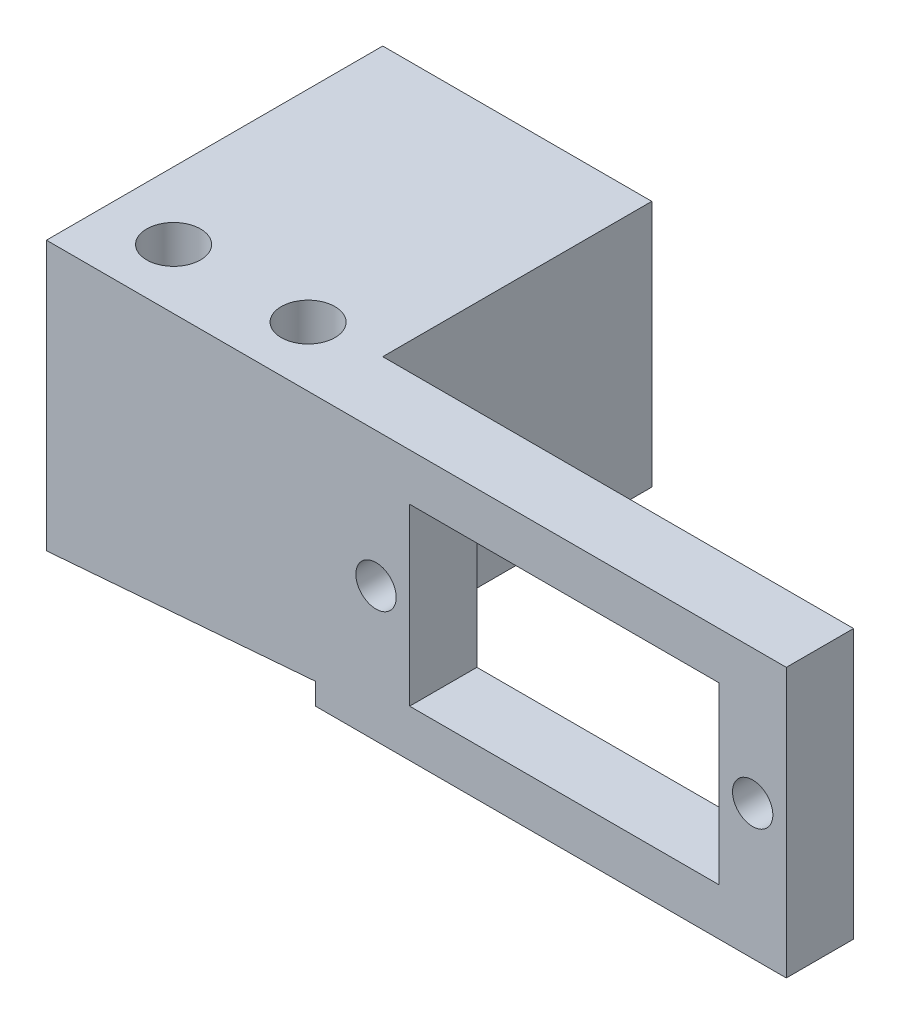
ISO-10303-21;
HEADER;
FILE_DESCRIPTION(('STEP AP214'),'2;1');
FILE_NAME('part.step','',(''),(''),'','','');
FILE_SCHEMA(('AUTOMOTIVE_DESIGN { 1 0 10303 214 1 1 1 1 }'));
ENDSEC;
DATA;
#1=APPLICATION_CONTEXT('core data for automotive mechanical design processes');
#2=APPLICATION_PROTOCOL_DEFINITION('international standard','automotive_design',2000,#1);
#3=PRODUCT_CONTEXT('',#1,'mechanical');
#4=PRODUCT('Part','Part','',(#3));
#5=PRODUCT_RELATED_PRODUCT_CATEGORY('part','',(#4));
#6=PRODUCT_DEFINITION_FORMATION('','',#4);
#7=PRODUCT_DEFINITION_CONTEXT('part definition',#1,'design');
#8=PRODUCT_DEFINITION('design','',#6,#7);
#9=PRODUCT_DEFINITION_SHAPE('','',#8);
#10=(LENGTH_UNIT() NAMED_UNIT(*) SI_UNIT(.MILLI.,.METRE.));
#11=(NAMED_UNIT(*) PLANE_ANGLE_UNIT() SI_UNIT($,.RADIAN.));
#12=(NAMED_UNIT(*) SI_UNIT($,.STERADIAN.) SOLID_ANGLE_UNIT());
#13=UNCERTAINTY_MEASURE_WITH_UNIT(LENGTH_MEASURE(1.E-05),#10,'distance_accuracy_value','');
#14=(GEOMETRIC_REPRESENTATION_CONTEXT(3) GLOBAL_UNCERTAINTY_ASSIGNED_CONTEXT((#13)) GLOBAL_UNIT_ASSIGNED_CONTEXT((#10,
#11,#12)) REPRESENTATION_CONTEXT('',''));
#15=CARTESIAN_POINT('',(0.,0.,0.));
#16=DIRECTION('',(0.,0.,1.));
#17=DIRECTION('',(1.,0.,0.));
#18=AXIS2_PLACEMENT_3D('',#15,#16,#17);
#19=CARTESIAN_POINT('',(-28.3333333333334,8.33333333333334,10.));
#20=DIRECTION('',(1.,0.,0.));
#21=DIRECTION('',(0.,0.,-1.));
#22=AXIS2_PLACEMENT_3D('',#19,#20,#21);
#23=PLANE('',#22);
#24=DIRECTION('',(0.,0.,-1.));
#25=VECTOR('',#24,1.);
#26=CARTESIAN_POINT('',(-28.3333333333334,8.33333333333334,10.));
#27=LINE('',#26,#25);
#28=CARTESIAN_POINT('',(-28.3333333333334,8.33333333333334,10.));
#29=VERTEX_POINT('',#28);
#30=CARTESIAN_POINT('',(-28.3333333333334,8.33333333333334,-15.));
#31=VERTEX_POINT('',#30);
#32=EDGE_CURVE('E154',#29,#31,#27,.T.);
#33=ORIENTED_EDGE('',*,*,#32,.T.);
#34=DIRECTION('',(0.,1.,0.));
#35=VECTOR('',#34,1.);
#36=CARTESIAN_POINT('',(-28.3333333333334,-11.6666666666667,-15.));
#37=LINE('',#36,#35);
#38=CARTESIAN_POINT('',(-28.3333333333334,-11.6666666666667,-15.));
#39=VERTEX_POINT('',#38);
#40=EDGE_CURVE('E182',#39,#31,#37,.T.);
#41=ORIENTED_EDGE('',*,*,#40,.F.);
#42=DIRECTION('',(0.,0.,-1.));
#43=VECTOR('',#42,1.);
#44=CARTESIAN_POINT('',(-28.3333333333334,-11.6666666666667,10.));
#45=LINE('',#44,#43);
#46=CARTESIAN_POINT('',(-28.3333333333334,-11.6666666666667,10.));
#47=VERTEX_POINT('',#46);
#48=EDGE_CURVE('E47',#47,#39,#45,.T.);
#49=ORIENTED_EDGE('',*,*,#48,.F.);
#50=DIRECTION('',(0.,-1.,0.));
#51=VECTOR('',#50,1.);
#52=CARTESIAN_POINT('',(-28.3333333333334,8.33333333333334,10.));
#53=LINE('',#52,#51);
#54=EDGE_CURVE('E239',#29,#47,#53,.T.);
#55=ORIENTED_EDGE('',*,*,#54,.F.);
#56=EDGE_LOOP('',(#33,#41,#49,#55));
#57=FACE_BOUND('',#56,.T.);
#58=ADVANCED_FACE('F39',(#57),#23,.F.);
#59=CARTESIAN_POINT('',(-28.3333333333334,-11.6666666666667,10.));
#60=DIRECTION('',(0.,1.,0.));
#61=DIRECTION('',(0.,0.,1.));
#62=AXIS2_PLACEMENT_3D('',#59,#60,#61);
#63=PLANE('',#62);
#64=DIRECTION('',(0.,0.,-1.));
#65=VECTOR('',#64,1.);
#66=CARTESIAN_POINT('',(-8.33333333333336,-11.6666666666667,15.));
#67=LINE('',#66,#65);
#68=CARTESIAN_POINT('',(-8.33333333333336,-11.6666666666667,10.));
#69=VERTEX_POINT('',#68);
#70=CARTESIAN_POINT('',(-8.33333333333336,-11.6666666666667,5.));
#71=VERTEX_POINT('',#70);
#72=EDGE_CURVE('E142',#69,#71,#67,.T.);
#73=ORIENTED_EDGE('',*,*,#72,.T.);
#74=DIRECTION('',(-1.,0.,0.));
#75=VECTOR('',#74,1.);
#76=CARTESIAN_POINT('',(26.6666666666666,-11.6666666666667,5.));
#77=LINE('',#76,#75);
#78=CARTESIAN_POINT('',(26.6666666666666,-11.6666666666667,5.));
#79=VERTEX_POINT('',#78);
#80=EDGE_CURVE('E62',#79,#71,#77,.T.);
#81=ORIENTED_EDGE('',*,*,#80,.F.);
#82=DIRECTION('',(0.,0.,-1.));
#83=VECTOR('',#82,1.);
#84=CARTESIAN_POINT('',(26.6666666666666,-11.6666666666667,10.));
#85=LINE('',#84,#83);
#86=CARTESIAN_POINT('',(26.6666666666666,-11.6666666666667,10.));
#87=VERTEX_POINT('',#86);
#88=EDGE_CURVE('E140',#87,#79,#85,.T.);
#89=ORIENTED_EDGE('',*,*,#88,.F.);
#90=DIRECTION('',(1.,0.,0.));
#91=VECTOR('',#90,1.);
#92=CARTESIAN_POINT('',(-28.3333333333334,-11.6666666666667,10.));
#93=LINE('',#92,#91);
#94=EDGE_CURVE('E246',#69,#87,#93,.T.);
#95=ORIENTED_EDGE('',*,*,#94,.F.);
#96=EDGE_LOOP('',(#73,#81,#89,#95));
#97=FACE_BOUND('',#96,.T.);
#98=ADVANCED_FACE('F138',(#97),#63,.F.);
#99=CARTESIAN_POINT('',(26.6666666666666,8.33333333333334,10.));
#100=DIRECTION('',(-1.,0.,0.));
#101=DIRECTION('',(0.,0.,1.));
#102=AXIS2_PLACEMENT_3D('',#99,#100,#101);
#103=PLANE('',#102);
#104=ORIENTED_EDGE('',*,*,#88,.T.);
#105=DIRECTION('',(0.,-1.,0.));
#106=VECTOR('',#105,1.);
#107=CARTESIAN_POINT('',(26.6666666666666,-11.6666666666667,5.));
#108=LINE('',#107,#106);
#109=CARTESIAN_POINT('',(26.6666666666666,8.33333333333334,5.));
#110=VERTEX_POINT('',#109);
#111=EDGE_CURVE('E123',#110,#79,#108,.T.);
#112=ORIENTED_EDGE('',*,*,#111,.F.);
#113=DIRECTION('',(0.,0.,-1.));
#114=VECTOR('',#113,1.);
#115=CARTESIAN_POINT('',(26.6666666666666,8.33333333333334,10.));
#116=LINE('',#115,#114);
#117=CARTESIAN_POINT('',(26.6666666666666,8.33333333333334,10.));
#118=VERTEX_POINT('',#117);
#119=EDGE_CURVE('E149',#118,#110,#116,.T.);
#120=ORIENTED_EDGE('',*,*,#119,.F.);
#121=DIRECTION('',(0.,1.,0.));
#122=VECTOR('',#121,1.);
#123=CARTESIAN_POINT('',(26.6666666666666,8.33333333333334,10.));
#124=LINE('',#123,#122);
#125=EDGE_CURVE('E147',#87,#118,#124,.T.);
#126=ORIENTED_EDGE('',*,*,#125,.F.);
#127=EDGE_LOOP('',(#104,#112,#120,#126));
#128=FACE_BOUND('',#127,.T.);
#129=ADVANCED_FACE('F146',(#128),#103,.F.);
#130=CARTESIAN_POINT('',(-28.3333333333334,8.33333333333334,10.));
#131=DIRECTION('',(0.,-1.,0.));
#132=DIRECTION('',(0.,0.,-1.));
#133=AXIS2_PLACEMENT_3D('',#130,#131,#132);
#134=PLANE('',#133);
#135=CARTESIAN_POINT('',(-23.3333333333334,8.33333333333334,5.54812466747023));
#136=DIRECTION('',(0.,1.,0.));
#137=DIRECTION('',(0.,0.,1.));
#138=AXIS2_PLACEMENT_3D('',#135,#136,#137);
#139=CIRCLE('',#138,2.);
#140=CARTESIAN_POINT('',(-23.3333333333334,8.33333333333334,7.54812466747024));
#141=VERTEX_POINT('',#140);
#142=EDGE_CURVE('E235',#141,#141,#139,.T.);
#143=ORIENTED_EDGE('',*,*,#142,.F.);
#144=EDGE_LOOP('',(#143));
#145=FACE_BOUND('',#144,.T.);
#146=CARTESIAN_POINT('',(-13.3333333333334,8.33333333333334,5.54812466747023));
#147=DIRECTION('',(0.,1.,0.));
#148=DIRECTION('',(0.,0.,1.));
#149=AXIS2_PLACEMENT_3D('',#146,#147,#148);
#150=CIRCLE('',#149,2.);
#151=CARTESIAN_POINT('',(-13.3333333333334,8.33333333333334,7.54812466747023));
#152=VERTEX_POINT('',#151);
#153=EDGE_CURVE('E226',#152,#152,#150,.T.);
#154=ORIENTED_EDGE('',*,*,#153,.F.);
#155=EDGE_LOOP('',(#154));
#156=FACE_BOUND('',#155,.T.);
#157=DIRECTION('',(1.,0.,0.));
#158=VECTOR('',#157,1.);
#159=CARTESIAN_POINT('',(26.6666666666666,8.33333333333334,5.));
#160=LINE('',#159,#158);
#161=CARTESIAN_POINT('',(-8.33333333333336,8.33333333333334,5.));
#162=VERTEX_POINT('',#161);
#163=EDGE_CURVE('E128',#162,#110,#160,.T.);
#164=ORIENTED_EDGE('',*,*,#163,.F.);
#165=DIRECTION('',(0.,0.,1.));
#166=VECTOR('',#165,1.);
#167=CARTESIAN_POINT('',(-8.33333333333336,8.33333333333334,-15.));
#168=LINE('',#167,#166);
#169=CARTESIAN_POINT('',(-8.33333333333336,8.33333333333334,-15.));
#170=VERTEX_POINT('',#169);
#171=EDGE_CURVE('E195',#170,#162,#168,.T.);
#172=ORIENTED_EDGE('',*,*,#171,.F.);
#173=DIRECTION('',(1.,0.,0.));
#174=VECTOR('',#173,1.);
#175=CARTESIAN_POINT('',(-28.3333333333334,8.33333333333334,-15.));
#176=LINE('',#175,#174);
#177=EDGE_CURVE('E186',#31,#170,#176,.T.);
#178=ORIENTED_EDGE('',*,*,#177,.F.);
#179=ORIENTED_EDGE('',*,*,#32,.F.);
#180=DIRECTION('',(-1.,0.,0.));
#181=VECTOR('',#180,1.);
#182=CARTESIAN_POINT('',(-28.3333333333334,8.33333333333334,10.));
#183=LINE('',#182,#181);
#184=EDGE_CURVE('E251',#118,#29,#183,.T.);
#185=ORIENTED_EDGE('',*,*,#184,.F.);
#186=ORIENTED_EDGE('',*,*,#119,.T.);
#187=EDGE_LOOP('',(#164,#172,#178,#179,#185,#186));
#188=FACE_BOUND('',#187,.T.);
#189=ADVANCED_FACE('F266',(#145,#156,#188),#134,.F.);
#190=CARTESIAN_POINT('',(0.,0.,10.));
#191=DIRECTION('',(0.,0.,1.));
#192=DIRECTION('',(1.,0.,0.));
#193=AXIS2_PLACEMENT_3D('',#190,#191,#192);
#194=PLANE('',#193);
#195=DIRECTION('',(-0.996815278536125,-0.07974522228289,0.));
#196=VECTOR('',#195,1.);
#197=CARTESIAN_POINT('',(0.747217806041335,-9.34022257551669,10.));
#198=LINE('',#197,#196);
#199=CARTESIAN_POINT('',(-8.33333333333336,-10.0666666666667,10.));
#200=VERTEX_POINT('',#199);
#201=EDGE_CURVE('E166',#200,#47,#198,.T.);
#202=ORIENTED_EDGE('',*,*,#201,.F.);
#203=DIRECTION('',(0.,1.,0.));
#204=VECTOR('',#203,1.);
#205=CARTESIAN_POINT('',(-8.33333333333336,0.,10.));
#206=LINE('',#205,#204);
#207=EDGE_CURVE('E11',#69,#200,#206,.T.);
#208=ORIENTED_EDGE('',*,*,#207,.F.);
#209=ORIENTED_EDGE('',*,*,#94,.T.);
#210=ORIENTED_EDGE('',*,*,#125,.T.);
#211=ORIENTED_EDGE('',*,*,#184,.T.);
#212=ORIENTED_EDGE('',*,*,#54,.T.);
#213=EDGE_LOOP('',(#202,#208,#209,#210,#211,#212));
#214=FACE_BOUND('',#213,.T.);
#215=CARTESIAN_POINT('',(-3.83333333333336,-1.66666666666666,10.));
#216=DIRECTION('',(0.,0.,1.));
#217=DIRECTION('',(1.,0.,0.));
#218=AXIS2_PLACEMENT_3D('',#215,#216,#217);
#219=CIRCLE('',#218,1.5);
#220=CARTESIAN_POINT('',(-2.33333333333336,-1.66666666666666,10.));
#221=VERTEX_POINT('',#220);
#222=EDGE_CURVE('E198',#221,#221,#219,.T.);
#223=ORIENTED_EDGE('',*,*,#222,.F.);
#224=EDGE_LOOP('',(#223));
#225=FACE_BOUND('',#224,.T.);
#226=CARTESIAN_POINT('',(24.1666666666666,-1.66666666666666,10.));
#227=DIRECTION('',(0.,0.,1.));
#228=DIRECTION('',(1.,0.,0.));
#229=AXIS2_PLACEMENT_3D('',#226,#227,#228);
#230=CIRCLE('',#229,1.5);
#231=CARTESIAN_POINT('',(25.6666666666666,-1.66666666666666,10.));
#232=VERTEX_POINT('',#231);
#233=EDGE_CURVE('E199',#232,#232,#230,.T.);
#234=ORIENTED_EDGE('',*,*,#233,.F.);
#235=EDGE_LOOP('',(#234));
#236=FACE_BOUND('',#235,.T.);
#237=DIRECTION('',(0.,1.,0.));
#238=VECTOR('',#237,1.);
#239=CARTESIAN_POINT('',(21.6666666666666,4.83333333333334,10.));
#240=LINE('',#239,#238);
#241=CARTESIAN_POINT('',(21.6666666666666,-8.16666666666666,10.));
#242=VERTEX_POINT('',#241);
#243=CARTESIAN_POINT('',(21.6666666666666,4.83333333333334,10.));
#244=VERTEX_POINT('',#243);
#245=EDGE_CURVE('E203',#242,#244,#240,.T.);
#246=ORIENTED_EDGE('',*,*,#245,.F.);
#247=DIRECTION('',(1.,0.,0.));
#248=VECTOR('',#247,1.);
#249=CARTESIAN_POINT('',(21.6666666666666,-8.16666666666666,10.));
#250=LINE('',#249,#248);
#251=CARTESIAN_POINT('',(-1.33333333333336,-8.16666666666666,10.));
#252=VERTEX_POINT('',#251);
#253=EDGE_CURVE('E218',#252,#242,#250,.T.);
#254=ORIENTED_EDGE('',*,*,#253,.F.);
#255=DIRECTION('',(0.,-1.,0.));
#256=VECTOR('',#255,1.);
#257=CARTESIAN_POINT('',(-1.33333333333336,4.83333333333334,10.));
#258=LINE('',#257,#256);
#259=CARTESIAN_POINT('',(-1.33333333333336,4.83333333333334,10.));
#260=VERTEX_POINT('',#259);
#261=EDGE_CURVE('E214',#260,#252,#258,.T.);
#262=ORIENTED_EDGE('',*,*,#261,.F.);
#263=DIRECTION('',(-1.,0.,0.));
#264=VECTOR('',#263,1.);
#265=CARTESIAN_POINT('',(21.6666666666666,4.83333333333334,10.));
#266=LINE('',#265,#264);
#267=EDGE_CURVE('E210',#244,#260,#266,.T.);
#268=ORIENTED_EDGE('',*,*,#267,.F.);
#269=EDGE_LOOP('',(#246,#254,#262,#268));
#270=FACE_BOUND('',#269,.T.);
#271=ADVANCED_FACE('F279',(#214,#225,#236,#270),#194,.T.);
#272=CARTESIAN_POINT('',(-13.3333333333334,-11.6666666666667,5.54812466747023));
#273=DIRECTION('',(0.,1.,0.));
#274=DIRECTION('',(0.,0.,1.));
#275=AXIS2_PLACEMENT_3D('',#272,#273,#274);
#276=CYLINDRICAL_SURFACE('',#275,2.);
#277=CARTESIAN_POINT('',(-13.3333333333334,-10.4666666666667,5.54812466747023));
#278=DIRECTION('',(-0.07974522228289,0.996815278536125,0.));
#279=DIRECTION('',(0.996815278536125,0.07974522228289,0.));
#280=AXIS2_PLACEMENT_3D('',#277,#278,#279);
#281=ELLIPSE('',#280,2.00638979263751,2.);
#282=CARTESIAN_POINT('',(-11.3333333333334,-10.3066666666667,5.54812466747023));
#283=VERTEX_POINT('',#282);
#284=EDGE_CURVE('E160',#283,#283,#281,.F.);
#285=ORIENTED_EDGE('',*,*,#284,.T.);
#286=EDGE_LOOP('',(#285));
#287=FACE_BOUND('',#286,.T.);
#288=ORIENTED_EDGE('',*,*,#153,.T.);
#289=EDGE_LOOP('',(#288));
#290=FACE_BOUND('',#289,.T.);
#291=ADVANCED_FACE('F348',(#287,#290),#276,.F.);
#292=CARTESIAN_POINT('',(-23.3333333333334,-11.6666666666667,5.54812466747023));
#293=DIRECTION('',(0.,1.,0.));
#294=DIRECTION('',(0.,0.,1.));
#295=AXIS2_PLACEMENT_3D('',#292,#293,#294);
#296=CYLINDRICAL_SURFACE('',#295,2.);
#297=CARTESIAN_POINT('',(-23.3333333333334,-11.2666666666667,5.54812466747023));
#298=DIRECTION('',(-0.07974522228289,0.996815278536125,0.));
#299=DIRECTION('',(0.996815278536125,0.07974522228289,0.));
#300=AXIS2_PLACEMENT_3D('',#297,#298,#299);
#301=ELLIPSE('',#300,2.00638979263752,2.);
#302=CARTESIAN_POINT('',(-21.3333333333334,-11.1066666666667,5.54812466747023));
#303=VERTEX_POINT('',#302);
#304=EDGE_CURVE('E157',#303,#303,#301,.F.);
#305=ORIENTED_EDGE('',*,*,#304,.T.);
#306=EDGE_LOOP('',(#305));
#307=FACE_BOUND('',#306,.T.);
#308=ORIENTED_EDGE('',*,*,#142,.T.);
#309=EDGE_LOOP('',(#308));
#310=FACE_BOUND('',#309,.T.);
#311=ADVANCED_FACE('F351',(#307,#310),#296,.F.);
#312=CARTESIAN_POINT('',(21.6666666666666,4.83333333333334,-10.));
#313=DIRECTION('',(1.,0.,0.));
#314=DIRECTION('',(0.,0.,-1.));
#315=AXIS2_PLACEMENT_3D('',#312,#313,#314);
#316=PLANE('',#315);
#317=DIRECTION('',(0.,0.,1.));
#318=VECTOR('',#317,1.);
#319=CARTESIAN_POINT('',(21.6666666666666,4.83333333333334,-10.));
#320=LINE('',#319,#318);
#321=CARTESIAN_POINT('',(21.6666666666666,4.83333333333334,5.));
#322=VERTEX_POINT('',#321);
#323=EDGE_CURVE('E222',#322,#244,#320,.T.);
#324=ORIENTED_EDGE('',*,*,#323,.F.);
#325=DIRECTION('',(0.,-1.,0.));
#326=VECTOR('',#325,1.);
#327=CARTESIAN_POINT('',(21.6666666666666,4.83333333333334,5.));
#328=LINE('',#327,#326);
#329=CARTESIAN_POINT('',(21.6666666666666,-8.16666666666666,5.));
#330=VERTEX_POINT('',#329);
#331=EDGE_CURVE('E54',#322,#330,#328,.T.);
#332=ORIENTED_EDGE('',*,*,#331,.T.);
#333=DIRECTION('',(0.,0.,1.));
#334=VECTOR('',#333,1.);
#335=CARTESIAN_POINT('',(21.6666666666666,-8.16666666666666,-10.));
#336=LINE('',#335,#334);
#337=EDGE_CURVE('E223',#330,#242,#336,.T.);
#338=ORIENTED_EDGE('',*,*,#337,.T.);
#339=ORIENTED_EDGE('',*,*,#245,.T.);
#340=EDGE_LOOP('',(#324,#332,#338,#339));
#341=FACE_BOUND('',#340,.T.);
#342=ADVANCED_FACE('F313',(#341),#316,.F.);
#343=CARTESIAN_POINT('',(21.6666666666666,-8.16666666666666,-10.));
#344=DIRECTION('',(0.,-1.,0.));
#345=DIRECTION('',(1.,0.,0.));
#346=AXIS2_PLACEMENT_3D('',#343,#344,#345);
#347=PLANE('',#346);
#348=ORIENTED_EDGE('',*,*,#337,.F.);
#349=DIRECTION('',(-1.,0.,0.));
#350=VECTOR('',#349,1.);
#351=CARTESIAN_POINT('',(21.6666666666666,-8.16666666666666,5.));
#352=LINE('',#351,#350);
#353=CARTESIAN_POINT('',(-1.33333333333336,-8.16666666666666,5.));
#354=VERTEX_POINT('',#353);
#355=EDGE_CURVE('E304',#330,#354,#352,.T.);
#356=ORIENTED_EDGE('',*,*,#355,.T.);
#357=DIRECTION('',(0.,0.,1.));
#358=VECTOR('',#357,1.);
#359=CARTESIAN_POINT('',(-1.33333333333336,-8.16666666666666,-10.));
#360=LINE('',#359,#358);
#361=EDGE_CURVE('E227',#354,#252,#360,.T.);
#362=ORIENTED_EDGE('',*,*,#361,.T.);
#363=ORIENTED_EDGE('',*,*,#253,.T.);
#364=EDGE_LOOP('',(#348,#356,#362,#363));
#365=FACE_BOUND('',#364,.T.);
#366=ADVANCED_FACE('F314',(#365),#347,.F.);
#367=CARTESIAN_POINT('',(-1.33333333333336,4.83333333333334,-10.));
#368=DIRECTION('',(-1.,0.,0.));
#369=DIRECTION('',(0.,-1.,0.));
#370=AXIS2_PLACEMENT_3D('',#367,#368,#369);
#371=PLANE('',#370);
#372=ORIENTED_EDGE('',*,*,#361,.F.);
#373=DIRECTION('',(0.,1.,0.));
#374=VECTOR('',#373,1.);
#375=CARTESIAN_POINT('',(-1.33333333333336,4.83333333333334,5.));
#376=LINE('',#375,#374);
#377=CARTESIAN_POINT('',(-1.33333333333336,4.83333333333334,5.));
#378=VERTEX_POINT('',#377);
#379=EDGE_CURVE('E301',#354,#378,#376,.T.);
#380=ORIENTED_EDGE('',*,*,#379,.T.);
#381=DIRECTION('',(0.,0.,1.));
#382=VECTOR('',#381,1.);
#383=CARTESIAN_POINT('',(-1.33333333333336,4.83333333333334,-10.));
#384=LINE('',#383,#382);
#385=EDGE_CURVE('E230',#378,#260,#384,.T.);
#386=ORIENTED_EDGE('',*,*,#385,.T.);
#387=ORIENTED_EDGE('',*,*,#261,.T.);
#388=EDGE_LOOP('',(#372,#380,#386,#387));
#389=FACE_BOUND('',#388,.T.);
#390=ADVANCED_FACE('F324',(#389),#371,.F.);
#391=CARTESIAN_POINT('',(21.6666666666666,4.83333333333334,-10.));
#392=DIRECTION('',(0.,1.,0.));
#393=DIRECTION('',(-1.,0.,0.));
#394=AXIS2_PLACEMENT_3D('',#391,#392,#393);
#395=PLANE('',#394);
#396=ORIENTED_EDGE('',*,*,#385,.F.);
#397=DIRECTION('',(1.,0.,0.));
#398=VECTOR('',#397,1.);
#399=CARTESIAN_POINT('',(21.6666666666666,4.83333333333334,5.));
#400=LINE('',#399,#398);
#401=EDGE_CURVE('E298',#378,#322,#400,.T.);
#402=ORIENTED_EDGE('',*,*,#401,.T.);
#403=ORIENTED_EDGE('',*,*,#323,.T.);
#404=ORIENTED_EDGE('',*,*,#267,.T.);
#405=EDGE_LOOP('',(#396,#402,#403,#404));
#406=FACE_BOUND('',#405,.T.);
#407=ADVANCED_FACE('F322',(#406),#395,.F.);
#408=CARTESIAN_POINT('',(24.1666666666666,-1.66666666666666,-10.));
#409=DIRECTION('',(0.,0.,1.));
#410=DIRECTION('',(1.,0.,0.));
#411=AXIS2_PLACEMENT_3D('',#408,#409,#410);
#412=CYLINDRICAL_SURFACE('',#411,1.5);
#413=CARTESIAN_POINT('',(24.1666666666666,-1.66666666666666,5.));
#414=DIRECTION('',(0.,0.,1.));
#415=DIRECTION('',(1.,0.,0.));
#416=AXIS2_PLACEMENT_3D('',#413,#414,#415);
#417=CIRCLE('',#416,1.5);
#418=CARTESIAN_POINT('',(25.6666666666666,-1.66666666666666,5.));
#419=VERTEX_POINT('',#418);
#420=EDGE_CURVE('E294',#419,#419,#417,.F.);
#421=ORIENTED_EDGE('',*,*,#420,.T.);
#422=EDGE_LOOP('',(#421));
#423=FACE_BOUND('',#422,.T.);
#424=ORIENTED_EDGE('',*,*,#233,.T.);
#425=EDGE_LOOP('',(#424));
#426=FACE_BOUND('',#425,.T.);
#427=ADVANCED_FACE('F331',(#423,#426),#412,.F.);
#428=CARTESIAN_POINT('',(-3.83333333333336,-1.66666666666666,-10.));
#429=DIRECTION('',(0.,0.,1.));
#430=DIRECTION('',(1.,0.,0.));
#431=AXIS2_PLACEMENT_3D('',#428,#429,#430);
#432=CYLINDRICAL_SURFACE('',#431,1.5);
#433=CARTESIAN_POINT('',(-3.83333333333336,-1.66666666666666,5.));
#434=DIRECTION('',(0.,0.,1.));
#435=DIRECTION('',(1.,0.,0.));
#436=AXIS2_PLACEMENT_3D('',#433,#434,#435);
#437=CIRCLE('',#436,1.5);
#438=CARTESIAN_POINT('',(-2.33333333333336,-1.66666666666666,5.));
#439=VERTEX_POINT('',#438);
#440=EDGE_CURVE('E288',#439,#439,#437,.F.);
#441=ORIENTED_EDGE('',*,*,#440,.T.);
#442=EDGE_LOOP('',(#441));
#443=FACE_BOUND('',#442,.T.);
#444=ORIENTED_EDGE('',*,*,#222,.T.);
#445=EDGE_LOOP('',(#444));
#446=FACE_BOUND('',#445,.T.);
#447=ADVANCED_FACE('F384',(#443,#446),#432,.F.);
#448=CARTESIAN_POINT('',(-8.33333333333336,-10.0666666666667,-15.));
#449=DIRECTION('',(-0.07974522228289,0.996815278536125,0.));
#450=DIRECTION('',(-0.996815278536125,-0.07974522228289,0.));
#451=AXIS2_PLACEMENT_3D('',#448,#449,#450);
#452=PLANE('',#451);
#453=DIRECTION('',(0.,0.,1.));
#454=VECTOR('',#453,1.);
#455=CARTESIAN_POINT('',(-8.33333333333336,-10.0666666666667,-15.));
#456=LINE('',#455,#454);
#457=CARTESIAN_POINT('',(-8.33333333333336,-10.0666666666667,-15.));
#458=VERTEX_POINT('',#457);
#459=CARTESIAN_POINT('',(-8.33333333333336,-10.0666666666667,5.));
#460=VERTEX_POINT('',#459);
#461=EDGE_CURVE('E192',#458,#460,#456,.T.);
#462=ORIENTED_EDGE('',*,*,#461,.T.);
#463=DIRECTION('',(0.,0.,-1.));
#464=VECTOR('',#463,1.);
#465=CARTESIAN_POINT('',(-8.33333333333336,-10.0666666666667,15.));
#466=LINE('',#465,#464);
#467=EDGE_CURVE('E168',#200,#460,#466,.T.);
#468=ORIENTED_EDGE('',*,*,#467,.F.);
#469=ORIENTED_EDGE('',*,*,#201,.T.);
#470=ORIENTED_EDGE('',*,*,#48,.T.);
#471=DIRECTION('',(-0.996815278536125,-0.07974522228289,0.));
#472=VECTOR('',#471,1.);
#473=CARTESIAN_POINT('',(-8.33333333333336,-10.0666666666667,-15.));
#474=LINE('',#473,#472);
#475=EDGE_CURVE('E178',#458,#39,#474,.T.);
#476=ORIENTED_EDGE('',*,*,#475,.F.);
#477=EDGE_LOOP('',(#462,#468,#469,#470,#476));
#478=FACE_BOUND('',#477,.T.);
#479=ORIENTED_EDGE('',*,*,#304,.F.);
#480=EDGE_LOOP('',(#479));
#481=FACE_BOUND('',#480,.T.);
#482=ORIENTED_EDGE('',*,*,#284,.F.);
#483=EDGE_LOOP('',(#482));
#484=FACE_BOUND('',#483,.T.);
#485=ADVANCED_FACE('F274',(#478,#481,#484),#452,.F.);
#486=CARTESIAN_POINT('',(-8.33333333333336,8.33333333333334,-15.));
#487=DIRECTION('',(-1.,0.,0.));
#488=DIRECTION('',(0.,-1.,0.));
#489=AXIS2_PLACEMENT_3D('',#486,#487,#488);
#490=PLANE('',#489);
#491=ORIENTED_EDGE('',*,*,#171,.T.);
#492=DIRECTION('',(0.,1.,0.));
#493=VECTOR('',#492,1.);
#494=CARTESIAN_POINT('',(-8.33333333333336,-11.6666666666667,5.));
#495=LINE('',#494,#493);
#496=EDGE_CURVE('E144',#460,#162,#495,.T.);
#497=ORIENTED_EDGE('',*,*,#496,.F.);
#498=ORIENTED_EDGE('',*,*,#461,.F.);
#499=DIRECTION('',(0.,-1.,0.));
#500=VECTOR('',#499,1.);
#501=CARTESIAN_POINT('',(-8.33333333333336,8.33333333333334,-15.));
#502=LINE('',#501,#500);
#503=EDGE_CURVE('E189',#170,#458,#502,.T.);
#504=ORIENTED_EDGE('',*,*,#503,.F.);
#505=EDGE_LOOP('',(#491,#497,#498,#504));
#506=FACE_BOUND('',#505,.T.);
#507=ADVANCED_FACE('F271',(#506),#490,.F.);
#508=CARTESIAN_POINT('',(0.,0.,-15.));
#509=DIRECTION('',(0.,0.,-1.));
#510=DIRECTION('',(-1.,0.,0.));
#511=AXIS2_PLACEMENT_3D('',#508,#509,#510);
#512=PLANE('',#511);
#513=ORIENTED_EDGE('',*,*,#475,.T.);
#514=ORIENTED_EDGE('',*,*,#40,.T.);
#515=ORIENTED_EDGE('',*,*,#177,.T.);
#516=ORIENTED_EDGE('',*,*,#503,.T.);
#517=EDGE_LOOP('',(#513,#514,#515,#516));
#518=FACE_BOUND('',#517,.T.);
#519=ADVANCED_FACE('F263',(#518),#512,.T.);
#520=CARTESIAN_POINT('',(-8.33333333333336,-10.0666666666667,15.));
#521=DIRECTION('',(1.,0.,0.));
#522=DIRECTION('',(0.,0.,-1.));
#523=AXIS2_PLACEMENT_3D('',#520,#521,#522);
#524=PLANE('',#523);
#525=ORIENTED_EDGE('',*,*,#467,.T.);
#526=EDGE_CURVE('E283',#71,#460,#495,.T.);
#527=ORIENTED_EDGE('',*,*,#526,.F.);
#528=ORIENTED_EDGE('',*,*,#72,.F.);
#529=ORIENTED_EDGE('',*,*,#207,.T.);
#530=EDGE_LOOP('',(#525,#527,#528,#529));
#531=FACE_BOUND('',#530,.T.);
#532=ADVANCED_FACE('F282',(#531),#524,.F.);
#533=CARTESIAN_POINT('',(0.,0.,5.));
#534=DIRECTION('',(0.,0.,1.));
#535=DIRECTION('',(1.,0.,0.));
#536=AXIS2_PLACEMENT_3D('',#533,#534,#535);
#537=PLANE('',#536);
#538=ORIENTED_EDGE('',*,*,#440,.F.);
#539=EDGE_LOOP('',(#538));
#540=FACE_BOUND('',#539,.T.);
#541=ORIENTED_EDGE('',*,*,#111,.T.);
#542=ORIENTED_EDGE('',*,*,#80,.T.);
#543=ORIENTED_EDGE('',*,*,#526,.T.);
#544=ORIENTED_EDGE('',*,*,#496,.T.);
#545=ORIENTED_EDGE('',*,*,#163,.T.);
#546=EDGE_LOOP('',(#541,#542,#543,#544,#545));
#547=FACE_BOUND('',#546,.T.);
#548=ORIENTED_EDGE('',*,*,#420,.F.);
#549=EDGE_LOOP('',(#548));
#550=FACE_BOUND('',#549,.T.);
#551=ORIENTED_EDGE('',*,*,#401,.F.);
#552=ORIENTED_EDGE('',*,*,#379,.F.);
#553=ORIENTED_EDGE('',*,*,#355,.F.);
#554=ORIENTED_EDGE('',*,*,#331,.F.);
#555=EDGE_LOOP('',(#551,#552,#553,#554));
#556=FACE_BOUND('',#555,.T.);
#557=ADVANCED_FACE('F124',(#540,#547,#550,#556),#537,.F.);
#558=CLOSED_SHELL('',(#58,#98,#129,#189,#271,#291,#311,#342,#366,#390,#407,#427,#447,#485,#507,
#519,#532,#557));
#559=MANIFOLD_SOLID_BREP('B2',#558);
#560=ADVANCED_BREP_SHAPE_REPRESENTATION('',(#18,#559),#14);
#561=SHAPE_DEFINITION_REPRESENTATION(#9,#560);
ENDSEC;
END-ISO-10303-21;
